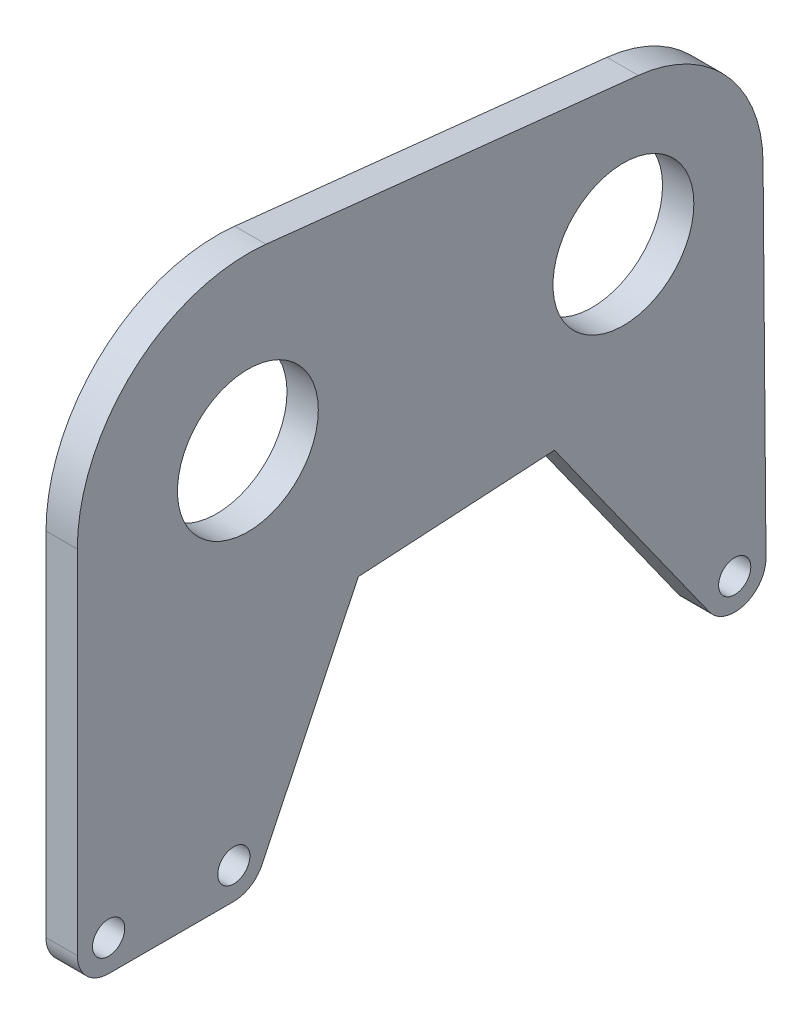
ISO-10303-21;
HEADER;
FILE_DESCRIPTION(('STEP AP214'),'2;1');
FILE_NAME('part.step','',(''),(''),'','','');
FILE_SCHEMA(('AUTOMOTIVE_DESIGN { 1 0 10303 214 1 1 1 1 }'));
ENDSEC;
DATA;
#1=APPLICATION_CONTEXT('core data for automotive mechanical design processes');
#2=APPLICATION_PROTOCOL_DEFINITION('international standard','automotive_design',2000,#1);
#3=PRODUCT_CONTEXT('',#1,'mechanical');
#4=PRODUCT('Part','Part','',(#3));
#5=PRODUCT_RELATED_PRODUCT_CATEGORY('part','',(#4));
#6=PRODUCT_DEFINITION_FORMATION('','',#4);
#7=PRODUCT_DEFINITION_CONTEXT('part definition',#1,'design');
#8=PRODUCT_DEFINITION('design','',#6,#7);
#9=PRODUCT_DEFINITION_SHAPE('','',#8);
#10=(LENGTH_UNIT() NAMED_UNIT(*) SI_UNIT(.MILLI.,.METRE.));
#11=(NAMED_UNIT(*) PLANE_ANGLE_UNIT() SI_UNIT($,.RADIAN.));
#12=(NAMED_UNIT(*) SI_UNIT($,.STERADIAN.) SOLID_ANGLE_UNIT());
#13=UNCERTAINTY_MEASURE_WITH_UNIT(LENGTH_MEASURE(1.E-05),#10,'distance_accuracy_value','');
#14=(GEOMETRIC_REPRESENTATION_CONTEXT(3) GLOBAL_UNCERTAINTY_ASSIGNED_CONTEXT((#13)) GLOBAL_UNIT_ASSIGNED_CONTEXT((#10,
#11,#12)) REPRESENTATION_CONTEXT('',''));
#15=CARTESIAN_POINT('',(0.,0.,0.));
#16=DIRECTION('',(0.,0.,1.));
#17=DIRECTION('',(1.,0.,0.));
#18=AXIS2_PLACEMENT_3D('',#15,#16,#17);
#19=CARTESIAN_POINT('',(6.35,1.3559669337432,-159.202917567701));
#20=DIRECTION('',(0.,0.00851691523062105,-0.999963730419736));
#21=DIRECTION('',(0.,0.999963730419736,0.00851691523062105));
#22=AXIS2_PLACEMENT_3D('',#19,#20,#21);
#23=PLANE('',#22);
#24=DIRECTION('',(0.,-0.999963730419736,-0.00851691523062105));
#25=VECTOR('',#24,1.);
#26=CARTESIAN_POINT('',(0.,1.3559669337432,-159.202917567701));
#27=LINE('',#26,#25);
#28=CARTESIAN_POINT('',(0.,-33.3606746563601,-159.498606985747));
#29=VERTEX_POINT('',#28);
#30=CARTESIAN_POINT('',(0.,-103.129192537428,-160.092841090928));
#31=VERTEX_POINT('',#30);
#32=EDGE_CURVE('E170',#29,#31,#27,.T.);
#33=ORIENTED_EDGE('',*,*,#32,.F.);
#34=DIRECTION('',(-1.,0.,0.));
#35=VECTOR('',#34,1.);
#36=CARTESIAN_POINT('',(6.35,-33.3606746563601,-159.498606985747));
#37=LINE('',#36,#35);
#38=CARTESIAN_POINT('',(6.35,-33.3606746563601,-159.498606985747));
#39=VERTEX_POINT('',#38);
#40=EDGE_CURVE('E11',#39,#29,#37,.T.);
#41=ORIENTED_EDGE('',*,*,#40,.F.);
#42=DIRECTION('',(0.,-0.999963730419736,-0.00851691523062105));
#43=VECTOR('',#42,1.);
#44=CARTESIAN_POINT('',(6.35,1.3559669337432,-159.202917567701));
#45=LINE('',#44,#43);
#46=CARTESIAN_POINT('',(6.35,-103.129192537428,-160.092841090928));
#47=VERTEX_POINT('',#46);
#48=EDGE_CURVE('E210',#39,#47,#45,.T.);
#49=ORIENTED_EDGE('',*,*,#48,.T.);
#50=DIRECTION('',(-1.,0.,0.));
#51=VECTOR('',#50,1.);
#52=CARTESIAN_POINT('',(6.35,-103.129192537428,-160.092841090928));
#53=LINE('',#52,#51);
#54=EDGE_CURVE('E100',#47,#31,#53,.T.);
#55=ORIENTED_EDGE('',*,*,#54,.T.);
#56=EDGE_LOOP('',(#33,#41,#49,#55));
#57=FACE_BOUND('',#56,.T.);
#58=ADVANCED_FACE('F37',(#57),#23,.T.);
#59=CARTESIAN_POINT('',(6.35,-33.6019548576729,-131.17010498144));
#60=DIRECTION('',(-1.,0.,0.));
#61=DIRECTION('',(0.,0.,1.));
#62=AXIS2_PLACEMENT_3D('',#59,#60,#61);
#63=CYLINDRICAL_SURFACE('',#62,28.329529504451);
#64=CARTESIAN_POINT('',(0.,-33.6019548576729,-131.17010498144));
#65=DIRECTION('',(1.,0.,0.));
#66=DIRECTION('',(0.,0.,-1.));
#67=AXIS2_PLACEMENT_3D('',#64,#65,#66);
#68=CIRCLE('',#67,28.329529504451);
#69=CARTESIAN_POINT('',(0.,-5.43348548716646,-134.18665520751));
#70=VERTEX_POINT('',#69);
#71=EDGE_CURVE('E173',#29,#70,#68,.T.);
#72=ORIENTED_EDGE('',*,*,#71,.T.);
#73=DIRECTION('',(-1.,0.,0.));
#74=VECTOR('',#73,1.);
#75=CARTESIAN_POINT('',(6.35,-5.43348548716646,-134.18665520751));
#76=LINE('',#75,#74);
#77=CARTESIAN_POINT('',(6.35,-5.43348548716646,-134.18665520751));
#78=VERTEX_POINT('',#77);
#79=EDGE_CURVE('E45',#78,#70,#76,.T.);
#80=ORIENTED_EDGE('',*,*,#79,.F.);
#81=CARTESIAN_POINT('',(6.35,-33.6019548576729,-131.17010498144));
#82=DIRECTION('',(1.,0.,0.));
#83=DIRECTION('',(0.,0.,-1.));
#84=AXIS2_PLACEMENT_3D('',#81,#82,#83);
#85=CIRCLE('',#84,28.329529504451);
#86=EDGE_CURVE('E279',#39,#78,#85,.T.);
#87=ORIENTED_EDGE('',*,*,#86,.F.);
#88=ORIENTED_EDGE('',*,*,#40,.T.);
#89=EDGE_LOOP('',(#72,#80,#87,#88));
#90=FACE_BOUND('',#89,.T.);
#91=ADVANCED_FACE('F239',(#90),#63,.T.);
#92=CARTESIAN_POINT('',(6.35,8.83518672114003,-0.946156645945603));
#93=DIRECTION('',(0.,0.994314761425204,-0.106480773907502));
#94=DIRECTION('',(0.,0.106480773907502,0.994314761425204));
#95=AXIS2_PLACEMENT_3D('',#92,#93,#94);
#96=PLANE('',#95);
#97=DIRECTION('',(0.,-0.106480773907502,-0.994314761425204));
#98=VECTOR('',#97,1.);
#99=CARTESIAN_POINT('',(0.,8.83518672114003,-0.946156645945603));
#100=LINE('',#99,#98);
#101=CARTESIAN_POINT('',(0.,2.65283508819284,-58.6767991213711));
#102=VERTEX_POINT('',#101);
#103=EDGE_CURVE('E176',#102,#70,#100,.T.);
#104=ORIENTED_EDGE('',*,*,#103,.F.);
#105=DIRECTION('',(-1.,0.,0.));
#106=VECTOR('',#105,1.);
#107=CARTESIAN_POINT('',(6.35,2.65283508819284,-58.6767991213711));
#108=LINE('',#107,#106);
#109=CARTESIAN_POINT('',(6.35,2.65283508819284,-58.6767991213711));
#110=VERTEX_POINT('',#109);
#111=EDGE_CURVE('E229',#110,#102,#108,.T.);
#112=ORIENTED_EDGE('',*,*,#111,.F.);
#113=DIRECTION('',(0.,-0.106480773907502,-0.994314761425204));
#114=VECTOR('',#113,1.);
#115=CARTESIAN_POINT('',(6.35,8.83518672114003,-0.946156645945603));
#116=LINE('',#115,#114);
#117=EDGE_CURVE('E236',#110,#78,#116,.T.);
#118=ORIENTED_EDGE('',*,*,#117,.T.);
#119=ORIENTED_EDGE('',*,*,#79,.T.);
#120=EDGE_LOOP('',(#104,#112,#118,#119));
#121=FACE_BOUND('',#120,.T.);
#122=ADVANCED_FACE('F234',(#121),#96,.T.);
#123=CARTESIAN_POINT('',(6.35,-31.7500000000001,-54.9926131403119));
#124=DIRECTION('',(-1.,0.,0.));
#125=DIRECTION('',(0.,0.,1.));
#126=AXIS2_PLACEMENT_3D('',#123,#124,#125);
#127=CYLINDRICAL_SURFACE('',#126,34.5995417375496);
#128=CARTESIAN_POINT('',(0.,-31.7500000000001,-54.9926131403119));
#129=DIRECTION('',(1.,0.,0.));
#130=DIRECTION('',(0.,0.,-1.));
#131=AXIS2_PLACEMENT_3D('',#128,#129,#130);
#132=CIRCLE('',#131,34.5995417375496);
#133=CARTESIAN_POINT('',(0.,-31.7500000000001,-20.3930714027624));
#134=VERTEX_POINT('',#133);
#135=EDGE_CURVE('E179',#102,#134,#132,.T.);
#136=ORIENTED_EDGE('',*,*,#135,.T.);
#137=DIRECTION('',(-1.,0.,0.));
#138=VECTOR('',#137,1.);
#139=CARTESIAN_POINT('',(6.35,-31.7500000000001,-20.3930714027624));
#140=LINE('',#139,#138);
#141=CARTESIAN_POINT('',(6.35,-31.7500000000001,-20.3930714027624));
#142=VERTEX_POINT('',#141);
#143=EDGE_CURVE('E226',#142,#134,#140,.T.);
#144=ORIENTED_EDGE('',*,*,#143,.F.);
#145=CARTESIAN_POINT('',(6.35,-31.7500000000001,-54.9926131403119));
#146=DIRECTION('',(1.,0.,0.));
#147=DIRECTION('',(0.,0.,-1.));
#148=AXIS2_PLACEMENT_3D('',#145,#146,#147);
#149=CIRCLE('',#148,34.5995417375496);
#150=EDGE_CURVE('E257',#110,#142,#149,.T.);
#151=ORIENTED_EDGE('',*,*,#150,.F.);
#152=ORIENTED_EDGE('',*,*,#111,.T.);
#153=EDGE_LOOP('',(#136,#144,#151,#152));
#154=FACE_BOUND('',#153,.T.);
#155=ADVANCED_FACE('F248',(#154),#127,.T.);
#156=CARTESIAN_POINT('',(6.35,0.,-20.3930714027624));
#157=DIRECTION('',(0.,0.,-1.));
#158=DIRECTION('',(0.,1.,0.));
#159=AXIS2_PLACEMENT_3D('',#156,#157,#158);
#160=PLANE('',#159);
#161=DIRECTION('',(0.,-1.,0.));
#162=VECTOR('',#161,1.);
#163=CARTESIAN_POINT('',(0.,0.,-20.3930714027624));
#164=LINE('',#163,#162);
#165=CARTESIAN_POINT('',(0.,-103.183274949142,-20.3930714027624));
#166=VERTEX_POINT('',#165);
#167=EDGE_CURVE('E181',#134,#166,#164,.T.);
#168=ORIENTED_EDGE('',*,*,#167,.T.);
#169=DIRECTION('',(-1.,0.,0.));
#170=VECTOR('',#169,1.);
#171=CARTESIAN_POINT('',(6.35,-103.183274949142,-20.3930714027624));
#172=LINE('',#171,#170);
#173=CARTESIAN_POINT('',(6.35,-103.183274949142,-20.3930714027624));
#174=VERTEX_POINT('',#173);
#175=EDGE_CURVE('E223',#174,#166,#172,.T.);
#176=ORIENTED_EDGE('',*,*,#175,.F.);
#177=DIRECTION('',(0.,-1.,0.));
#178=VECTOR('',#177,1.);
#179=CARTESIAN_POINT('',(6.35,0.,-20.3930714027624));
#180=LINE('',#179,#178);
#181=EDGE_CURVE('E254',#142,#174,#180,.T.);
#182=ORIENTED_EDGE('',*,*,#181,.F.);
#183=ORIENTED_EDGE('',*,*,#143,.T.);
#184=EDGE_LOOP('',(#168,#176,#182,#183));
#185=FACE_BOUND('',#184,.T.);
#186=ADVANCED_FACE('F252',(#185),#160,.F.);
#187=CARTESIAN_POINT('',(6.35,-103.183274949142,-26.7430714027624));
#188=DIRECTION('',(-1.,0.,0.));
#189=DIRECTION('',(0.,0.,1.));
#190=AXIS2_PLACEMENT_3D('',#187,#188,#189);
#191=CYLINDRICAL_SURFACE('',#190,6.35);
#192=CARTESIAN_POINT('',(0.,-103.183274949142,-26.7430714027624));
#193=DIRECTION('',(1.,0.,0.));
#194=DIRECTION('',(0.,0.,-1.));
#195=AXIS2_PLACEMENT_3D('',#192,#193,#194);
#196=CIRCLE('',#195,6.35);
#197=CARTESIAN_POINT('',(0.,-109.533274949142,-26.7430714027624));
#198=VERTEX_POINT('',#197);
#199=EDGE_CURVE('E183',#166,#198,#196,.T.);
#200=ORIENTED_EDGE('',*,*,#199,.T.);
#201=DIRECTION('',(-1.,0.,0.));
#202=VECTOR('',#201,1.);
#203=CARTESIAN_POINT('',(6.35,-109.533274949142,-26.7430714027624));
#204=LINE('',#203,#202);
#205=CARTESIAN_POINT('',(6.35,-109.533274949142,-26.7430714027624));
#206=VERTEX_POINT('',#205);
#207=EDGE_CURVE('E220',#206,#198,#204,.T.);
#208=ORIENTED_EDGE('',*,*,#207,.F.);
#209=CARTESIAN_POINT('',(6.35,-103.183274949142,-26.7430714027624));
#210=DIRECTION('',(1.,0.,0.));
#211=DIRECTION('',(0.,0.,-1.));
#212=AXIS2_PLACEMENT_3D('',#209,#210,#211);
#213=CIRCLE('',#212,6.35);
#214=EDGE_CURVE('E256',#174,#206,#213,.T.);
#215=ORIENTED_EDGE('',*,*,#214,.F.);
#216=ORIENTED_EDGE('',*,*,#175,.T.);
#217=EDGE_LOOP('',(#200,#208,#215,#216));
#218=FACE_BOUND('',#217,.T.);
#219=ADVANCED_FACE('F295',(#218),#191,.T.);
#220=CARTESIAN_POINT('',(6.35,-109.533274949142,0.));
#221=DIRECTION('',(0.,1.,0.));
#222=DIRECTION('',(0.,0.,1.));
#223=AXIS2_PLACEMENT_3D('',#220,#221,#222);
#224=PLANE('',#223);
#225=DIRECTION('',(0.,0.,-1.));
#226=VECTOR('',#225,1.);
#227=CARTESIAN_POINT('',(0.,-109.533274949142,0.));
#228=LINE('',#227,#226);
#229=CARTESIAN_POINT('',(0.,-109.533274949142,-52.1430714027624));
#230=VERTEX_POINT('',#229);
#231=EDGE_CURVE('E185',#198,#230,#228,.T.);
#232=ORIENTED_EDGE('',*,*,#231,.T.);
#233=DIRECTION('',(-1.,0.,0.));
#234=VECTOR('',#233,1.);
#235=CARTESIAN_POINT('',(6.35,-109.533274949142,-52.1430714027624));
#236=LINE('',#235,#234);
#237=CARTESIAN_POINT('',(6.35,-109.533274949142,-52.1430714027624));
#238=VERTEX_POINT('',#237);
#239=EDGE_CURVE('E217',#238,#230,#236,.T.);
#240=ORIENTED_EDGE('',*,*,#239,.F.);
#241=DIRECTION('',(0.,0.,-1.));
#242=VECTOR('',#241,1.);
#243=CARTESIAN_POINT('',(6.35,-109.533274949142,0.));
#244=LINE('',#243,#242);
#245=EDGE_CURVE('E259',#206,#238,#244,.T.);
#246=ORIENTED_EDGE('',*,*,#245,.F.);
#247=ORIENTED_EDGE('',*,*,#207,.T.);
#248=EDGE_LOOP('',(#232,#240,#246,#247));
#249=FACE_BOUND('',#248,.T.);
#250=ADVANCED_FACE('F298',(#249),#224,.F.);
#251=CARTESIAN_POINT('',(6.35,-103.183274949142,-52.1430714027624));
#252=DIRECTION('',(-1.,0.,0.));
#253=DIRECTION('',(0.,0.,1.));
#254=AXIS2_PLACEMENT_3D('',#251,#252,#253);
#255=CYLINDRICAL_SURFACE('',#254,6.34999999999999);
#256=CARTESIAN_POINT('',(0.,-103.183274949142,-52.1430714027624));
#257=DIRECTION('',(1.,0.,0.));
#258=DIRECTION('',(0.,0.,-1.));
#259=AXIS2_PLACEMENT_3D('',#256,#257,#258);
#260=CIRCLE('',#259,6.34999999999999);
#261=CARTESIAN_POINT('',(0.,-105.923011398147,-57.8716265600418));
#262=VERTEX_POINT('',#261);
#263=EDGE_CURVE('E187',#230,#262,#260,.T.);
#264=ORIENTED_EDGE('',*,*,#263,.T.);
#265=DIRECTION('',(-1.,0.,0.));
#266=VECTOR('',#265,1.);
#267=CARTESIAN_POINT('',(6.35,-105.923011398147,-57.8716265600418));
#268=LINE('',#267,#266);
#269=CARTESIAN_POINT('',(6.35,-105.923011398147,-57.8716265600418));
#270=VERTEX_POINT('',#269);
#271=EDGE_CURVE('E214',#270,#262,#268,.T.);
#272=ORIENTED_EDGE('',*,*,#271,.F.);
#273=CARTESIAN_POINT('',(6.35,-103.183274949142,-52.1430714027624));
#274=DIRECTION('',(1.,0.,0.));
#275=DIRECTION('',(0.,0.,-1.));
#276=AXIS2_PLACEMENT_3D('',#273,#274,#275);
#277=CIRCLE('',#276,6.34999999999999);
#278=EDGE_CURVE('E265',#238,#270,#277,.T.);
#279=ORIENTED_EDGE('',*,*,#278,.F.);
#280=ORIENTED_EDGE('',*,*,#239,.T.);
#281=EDGE_LOOP('',(#264,#272,#279,#280));
#282=FACE_BOUND('',#281,.T.);
#283=ADVANCED_FACE('F271',(#282),#255,.T.);
#284=CARTESIAN_POINT('',(6.35,-42.2432701322615,-88.3270736002361));
#285=DIRECTION('',(0.,0.43145455889843,0.902134670437713));
#286=DIRECTION('',(0.,-0.902134670437713,0.43145455889843));
#287=AXIS2_PLACEMENT_3D('',#284,#285,#286);
#288=PLANE('',#287);
#289=DIRECTION('',(0.,0.902134670437713,-0.43145455889843));
#290=VECTOR('',#289,1.);
#291=CARTESIAN_POINT('',(0.,-42.2432701322615,-88.3270736002361));
#292=LINE('',#291,#290);
#293=CARTESIAN_POINT('',(0.,-65.105702066972,-77.392896244044));
#294=VERTEX_POINT('',#293);
#295=EDGE_CURVE('E189',#262,#294,#292,.T.);
#296=ORIENTED_EDGE('',*,*,#295,.T.);
#297=DIRECTION('',(-1.,0.,0.));
#298=VECTOR('',#297,1.);
#299=CARTESIAN_POINT('',(6.35,-65.105702066972,-77.392896244044));
#300=LINE('',#299,#298);
#301=CARTESIAN_POINT('',(6.35,-65.105702066972,-77.392896244044));
#302=VERTEX_POINT('',#301);
#303=EDGE_CURVE('E147',#302,#294,#300,.T.);
#304=ORIENTED_EDGE('',*,*,#303,.F.);
#305=DIRECTION('',(0.,0.902134670437713,-0.43145455889843));
#306=VECTOR('',#305,1.);
#307=CARTESIAN_POINT('',(6.35,-42.2432701322615,-88.3270736002361));
#308=LINE('',#307,#306);
#309=EDGE_CURVE('E138',#270,#302,#308,.T.);
#310=ORIENTED_EDGE('',*,*,#309,.F.);
#311=ORIENTED_EDGE('',*,*,#271,.T.);
#312=EDGE_LOOP('',(#296,#304,#310,#311));
#313=FACE_BOUND('',#312,.T.);
#314=ADVANCED_FACE('F275',(#313),#288,.F.);
#315=CARTESIAN_POINT('',(6.35,-69.3705476391629,-4.03291650273945));
#316=DIRECTION('',(0.,0.998314382402172,0.0580378659925547));
#317=DIRECTION('',(0.,-0.0580378659925547,0.998314382402172));
#318=AXIS2_PLACEMENT_3D('',#315,#316,#317);
#319=PLANE('',#318);
#320=DIRECTION('',(0.,0.0580378659925547,-0.998314382402172));
#321=VECTOR('',#320,1.);
#322=CARTESIAN_POINT('',(0.,-69.3705476391629,-4.03291650273945));
#323=LINE('',#322,#321);
#324=CARTESIAN_POINT('',(0.,-62.7926420269908,-117.180043234755));
#325=VERTEX_POINT('',#324);
#326=EDGE_CURVE('E146',#294,#325,#323,.T.);
#327=ORIENTED_EDGE('',*,*,#326,.T.);
#328=DIRECTION('',(-1.,0.,0.));
#329=VECTOR('',#328,1.);
#330=CARTESIAN_POINT('',(6.35,-62.7926420269908,-117.180043234755));
#331=LINE('',#330,#329);
#332=CARTESIAN_POINT('',(6.35,-62.7926420269908,-117.180043234755));
#333=VERTEX_POINT('',#332);
#334=EDGE_CURVE('E143',#333,#325,#331,.T.);
#335=ORIENTED_EDGE('',*,*,#334,.F.);
#336=DIRECTION('',(0.,0.0580378659925547,-0.998314382402172));
#337=VECTOR('',#336,1.);
#338=CARTESIAN_POINT('',(6.35,-69.3705476391629,-4.03291650273945));
#339=LINE('',#338,#337);
#340=EDGE_CURVE('E131',#302,#333,#339,.T.);
#341=ORIENTED_EDGE('',*,*,#340,.F.);
#342=ORIENTED_EDGE('',*,*,#303,.T.);
#343=EDGE_LOOP('',(#327,#335,#341,#342));
#344=FACE_BOUND('',#343,.T.);
#345=ADVANCED_FACE('F144',(#344),#319,.F.);
#346=CARTESIAN_POINT('',(6.35,34.2382805707716,-48.0724800233674));
#347=DIRECTION('',(0.,0.580124617176137,-0.814527733442048));
#348=DIRECTION('',(0.,0.814527733442048,0.580124617176137));
#349=AXIS2_PLACEMENT_3D('',#346,#347,#348);
#350=PLANE('',#349);
#351=DIRECTION('',(0.,-0.814527733442048,-0.580124617176137));
#352=VECTOR('',#351,1.);
#353=CARTESIAN_POINT('',(0.,34.2382805707716,-48.0724800233674));
#354=LINE('',#353,#352);
#355=CARTESIAN_POINT('',(0.,-106.867066268211,-148.570820295405));
#356=VERTEX_POINT('',#355);
#357=EDGE_CURVE('E93',#325,#356,#354,.T.);
#358=ORIENTED_EDGE('',*,*,#357,.T.);
#359=DIRECTION('',(-1.,0.,0.));
#360=VECTOR('',#359,1.);
#361=CARTESIAN_POINT('',(6.35,-106.867066268211,-148.570820295405));
#362=LINE('',#361,#360);
#363=CARTESIAN_POINT('',(6.35,-106.867066268211,-148.570820295405));
#364=VERTEX_POINT('',#363);
#365=EDGE_CURVE('E148',#364,#356,#362,.T.);
#366=ORIENTED_EDGE('',*,*,#365,.F.);
#367=DIRECTION('',(0.,-0.814527733442048,-0.580124617176137));
#368=VECTOR('',#367,1.);
#369=CARTESIAN_POINT('',(6.35,34.2382805707716,-48.0724800233674));
#370=LINE('',#369,#368);
#371=EDGE_CURVE('E136',#333,#364,#370,.T.);
#372=ORIENTED_EDGE('',*,*,#371,.F.);
#373=ORIENTED_EDGE('',*,*,#334,.T.);
#374=EDGE_LOOP('',(#358,#366,#372,#373));
#375=FACE_BOUND('',#374,.T.);
#376=ADVANCED_FACE('F150',(#375),#350,.F.);
#377=CARTESIAN_POINT('',(6.35,-103.183274949142,-26.7430714027624));
#378=DIRECTION('',(-1.,0.,0.));
#379=DIRECTION('',(0.,0.,1.));
#380=AXIS2_PLACEMENT_3D('',#377,#378,#379);
#381=CYLINDRICAL_SURFACE('',#380,3.2639);
#382=CARTESIAN_POINT('',(6.35,-103.183274949142,-26.7430714027624));
#383=DIRECTION('',(1.,0.,0.));
#384=DIRECTION('',(0.,0.,-1.));
#385=AXIS2_PLACEMENT_3D('',#382,#383,#384);
#386=CIRCLE('',#385,3.2639);
#387=CARTESIAN_POINT('',(6.35,-103.183274949142,-30.0069714027624));
#388=VERTEX_POINT('',#387);
#389=EDGE_CURVE('E164',#388,#388,#386,.T.);
#390=ORIENTED_EDGE('',*,*,#389,.T.);
#391=EDGE_LOOP('',(#390));
#392=FACE_BOUND('',#391,.T.);
#393=CARTESIAN_POINT('',(0.,-103.183274949142,-26.7430714027624));
#394=DIRECTION('',(1.,0.,0.));
#395=DIRECTION('',(0.,0.,-1.));
#396=AXIS2_PLACEMENT_3D('',#393,#394,#395);
#397=CIRCLE('',#396,3.2639);
#398=CARTESIAN_POINT('',(0.,-103.183274949142,-30.0069714027624));
#399=VERTEX_POINT('',#398);
#400=EDGE_CURVE('E204',#399,#399,#397,.T.);
#401=ORIENTED_EDGE('',*,*,#400,.F.);
#402=EDGE_LOOP('',(#401));
#403=FACE_BOUND('',#402,.T.);
#404=ADVANCED_FACE('F311',(#392,#403),#381,.F.);
#405=CARTESIAN_POINT('',(6.35,-103.183274949142,-52.1430714027624));
#406=DIRECTION('',(-1.,0.,0.));
#407=DIRECTION('',(0.,0.,1.));
#408=AXIS2_PLACEMENT_3D('',#405,#406,#407);
#409=CYLINDRICAL_SURFACE('',#408,3.26389999999998);
#410=CARTESIAN_POINT('',(6.35,-103.183274949142,-52.1430714027624));
#411=DIRECTION('',(1.,0.,0.));
#412=DIRECTION('',(0.,0.,-1.));
#413=AXIS2_PLACEMENT_3D('',#410,#411,#412);
#414=CIRCLE('',#413,3.26389999999998);
#415=CARTESIAN_POINT('',(6.35,-103.183274949142,-55.4069714027623));
#416=VERTEX_POINT('',#415);
#417=EDGE_CURVE('E161',#416,#416,#414,.T.);
#418=ORIENTED_EDGE('',*,*,#417,.T.);
#419=EDGE_LOOP('',(#418));
#420=FACE_BOUND('',#419,.T.);
#421=CARTESIAN_POINT('',(0.,-103.183274949142,-52.1430714027624));
#422=DIRECTION('',(1.,0.,0.));
#423=DIRECTION('',(0.,0.,-1.));
#424=AXIS2_PLACEMENT_3D('',#421,#422,#423);
#425=CIRCLE('',#424,3.26389999999998);
#426=CARTESIAN_POINT('',(0.,-103.183274949142,-55.4069714027623));
#427=VERTEX_POINT('',#426);
#428=EDGE_CURVE('E201',#427,#427,#425,.T.);
#429=ORIENTED_EDGE('',*,*,#428,.F.);
#430=EDGE_LOOP('',(#429));
#431=FACE_BOUND('',#430,.T.);
#432=ADVANCED_FACE('F322',(#420,#431),#409,.F.);
#433=CARTESIAN_POINT('',(6.35,-33.6019548576729,-131.17010498144));
#434=DIRECTION('',(-1.,0.,0.));
#435=DIRECTION('',(0.,0.,1.));
#436=AXIS2_PLACEMENT_3D('',#433,#434,#435);
#437=CYLINDRICAL_SURFACE('',#436,14.2874999999999);
#438=CARTESIAN_POINT('',(6.35,-33.6019548576729,-131.17010498144));
#439=DIRECTION('',(1.,0.,0.));
#440=DIRECTION('',(0.,0.,-1.));
#441=AXIS2_PLACEMENT_3D('',#438,#439,#440);
#442=CIRCLE('',#441,14.2874999999999);
#443=CARTESIAN_POINT('',(6.35,-33.6019548576729,-145.45760498144));
#444=VERTEX_POINT('',#443);
#445=EDGE_CURVE('E158',#444,#444,#442,.T.);
#446=ORIENTED_EDGE('',*,*,#445,.T.);
#447=EDGE_LOOP('',(#446));
#448=FACE_BOUND('',#447,.T.);
#449=CARTESIAN_POINT('',(0.,-33.6019548576729,-131.17010498144));
#450=DIRECTION('',(1.,0.,0.));
#451=DIRECTION('',(0.,0.,-1.));
#452=AXIS2_PLACEMENT_3D('',#449,#450,#451);
#453=CIRCLE('',#452,14.2874999999999);
#454=CARTESIAN_POINT('',(0.,-33.6019548576729,-145.45760498144));
#455=VERTEX_POINT('',#454);
#456=EDGE_CURVE('E198',#455,#455,#453,.T.);
#457=ORIENTED_EDGE('',*,*,#456,.F.);
#458=EDGE_LOOP('',(#457));
#459=FACE_BOUND('',#458,.T.);
#460=ADVANCED_FACE('F318',(#448,#459),#437,.F.);
#461=CARTESIAN_POINT('',(6.35,-31.7500000000001,-54.9926131403119));
#462=DIRECTION('',(-1.,0.,0.));
#463=DIRECTION('',(0.,0.,1.));
#464=AXIS2_PLACEMENT_3D('',#461,#462,#463);
#465=CYLINDRICAL_SURFACE('',#464,14.2875);
#466=CARTESIAN_POINT('',(6.35,-31.7500000000001,-54.9926131403119));
#467=DIRECTION('',(1.,0.,0.));
#468=DIRECTION('',(0.,0.,-1.));
#469=AXIS2_PLACEMENT_3D('',#466,#467,#468);
#470=CIRCLE('',#469,14.2875);
#471=CARTESIAN_POINT('',(6.35,-31.7500000000001,-69.2801131403119));
#472=VERTEX_POINT('',#471);
#473=EDGE_CURVE('E152',#472,#472,#470,.T.);
#474=ORIENTED_EDGE('',*,*,#473,.T.);
#475=EDGE_LOOP('',(#474));
#476=FACE_BOUND('',#475,.T.);
#477=CARTESIAN_POINT('',(0.,-31.7500000000001,-54.9926131403119));
#478=DIRECTION('',(1.,0.,0.));
#479=DIRECTION('',(0.,0.,-1.));
#480=AXIS2_PLACEMENT_3D('',#477,#478,#479);
#481=CIRCLE('',#480,14.2875);
#482=CARTESIAN_POINT('',(0.,-31.7500000000001,-69.2801131403119));
#483=VERTEX_POINT('',#482);
#484=EDGE_CURVE('E195',#483,#483,#481,.T.);
#485=ORIENTED_EDGE('',*,*,#484,.F.);
#486=EDGE_LOOP('',(#485));
#487=FACE_BOUND('',#486,.T.);
#488=ADVANCED_FACE('F315',(#476,#487),#465,.F.);
#489=CARTESIAN_POINT('',(6.35,-103.183274949142,-153.743071402762));
#490=DIRECTION('',(-1.,0.,0.));
#491=DIRECTION('',(0.,0.,1.));
#492=AXIS2_PLACEMENT_3D('',#489,#490,#491);
#493=CYLINDRICAL_SURFACE('',#492,6.34999999999999);
#494=CARTESIAN_POINT('',(0.,-103.183274949142,-153.743071402762));
#495=DIRECTION('',(1.,0.,0.));
#496=DIRECTION('',(0.,0.,-1.));
#497=AXIS2_PLACEMENT_3D('',#494,#495,#496);
#498=CIRCLE('',#497,6.34999999999999);
#499=EDGE_CURVE('E193',#356,#31,#498,.T.);
#500=ORIENTED_EDGE('',*,*,#499,.T.);
#501=ORIENTED_EDGE('',*,*,#54,.F.);
#502=CARTESIAN_POINT('',(6.35,-103.183274949142,-153.743071402762));
#503=DIRECTION('',(1.,0.,0.));
#504=DIRECTION('',(0.,0.,-1.));
#505=AXIS2_PLACEMENT_3D('',#502,#503,#504);
#506=CIRCLE('',#505,6.34999999999999);
#507=EDGE_CURVE('E53',#364,#47,#506,.T.);
#508=ORIENTED_EDGE('',*,*,#507,.F.);
#509=ORIENTED_EDGE('',*,*,#365,.T.);
#510=EDGE_LOOP('',(#500,#501,#508,#509));
#511=FACE_BOUND('',#510,.T.);
#512=ADVANCED_FACE('F278',(#511),#493,.T.);
#513=CARTESIAN_POINT('',(6.35,-103.183274949142,-153.743071402762));
#514=DIRECTION('',(-1.,0.,0.));
#515=DIRECTION('',(0.,0.,1.));
#516=AXIS2_PLACEMENT_3D('',#513,#514,#515);
#517=CYLINDRICAL_SURFACE('',#516,3.26390000000001);
#518=CARTESIAN_POINT('',(6.35,-103.183274949142,-153.743071402762));
#519=DIRECTION('',(1.,0.,0.));
#520=DIRECTION('',(0.,0.,-1.));
#521=AXIS2_PLACEMENT_3D('',#518,#519,#520);
#522=CIRCLE('',#521,3.26390000000001);
#523=CARTESIAN_POINT('',(6.35,-103.183274949142,-157.006971402762));
#524=VERTEX_POINT('',#523);
#525=EDGE_CURVE('E167',#524,#524,#522,.T.);
#526=ORIENTED_EDGE('',*,*,#525,.T.);
#527=EDGE_LOOP('',(#526));
#528=FACE_BOUND('',#527,.T.);
#529=CARTESIAN_POINT('',(0.,-103.183274949142,-153.743071402762));
#530=DIRECTION('',(1.,0.,0.));
#531=DIRECTION('',(0.,0.,-1.));
#532=AXIS2_PLACEMENT_3D('',#529,#530,#531);
#533=CIRCLE('',#532,3.26390000000001);
#534=CARTESIAN_POINT('',(0.,-103.183274949142,-157.006971402762));
#535=VERTEX_POINT('',#534);
#536=EDGE_CURVE('E207',#535,#535,#533,.T.);
#537=ORIENTED_EDGE('',*,*,#536,.F.);
#538=EDGE_LOOP('',(#537));
#539=FACE_BOUND('',#538,.T.);
#540=ADVANCED_FACE('F314',(#528,#539),#517,.F.);
#541=CARTESIAN_POINT('',(6.35,0.,0.));
#542=DIRECTION('',(1.,0.,0.));
#543=DIRECTION('',(0.,0.,-1.));
#544=AXIS2_PLACEMENT_3D('',#541,#542,#543);
#545=PLANE('',#544);
#546=ORIENTED_EDGE('',*,*,#48,.F.);
#547=ORIENTED_EDGE('',*,*,#86,.T.);
#548=ORIENTED_EDGE('',*,*,#117,.F.);
#549=ORIENTED_EDGE('',*,*,#150,.T.);
#550=ORIENTED_EDGE('',*,*,#181,.T.);
#551=ORIENTED_EDGE('',*,*,#214,.T.);
#552=ORIENTED_EDGE('',*,*,#245,.T.);
#553=ORIENTED_EDGE('',*,*,#278,.T.);
#554=ORIENTED_EDGE('',*,*,#309,.T.);
#555=ORIENTED_EDGE('',*,*,#340,.T.);
#556=ORIENTED_EDGE('',*,*,#371,.T.);
#557=ORIENTED_EDGE('',*,*,#507,.T.);
#558=EDGE_LOOP('',(#546,#547,#548,#549,#550,#551,#552,#553,#554,#555,#556,#557));
#559=FACE_BOUND('',#558,.T.);
#560=ORIENTED_EDGE('',*,*,#473,.F.);
#561=EDGE_LOOP('',(#560));
#562=FACE_BOUND('',#561,.T.);
#563=ORIENTED_EDGE('',*,*,#445,.F.);
#564=EDGE_LOOP('',(#563));
#565=FACE_BOUND('',#564,.T.);
#566=ORIENTED_EDGE('',*,*,#417,.F.);
#567=EDGE_LOOP('',(#566));
#568=FACE_BOUND('',#567,.T.);
#569=ORIENTED_EDGE('',*,*,#389,.F.);
#570=EDGE_LOOP('',(#569));
#571=FACE_BOUND('',#570,.T.);
#572=ORIENTED_EDGE('',*,*,#525,.F.);
#573=EDGE_LOOP('',(#572));
#574=FACE_BOUND('',#573,.T.);
#575=ADVANCED_FACE('F133',(#559,#562,#565,#568,#571,#574),#545,.T.);
#576=CARTESIAN_POINT('',(0.,0.,0.));
#577=DIRECTION('',(1.,0.,0.));
#578=DIRECTION('',(0.,0.,-1.));
#579=AXIS2_PLACEMENT_3D('',#576,#577,#578);
#580=PLANE('',#579);
#581=ORIENTED_EDGE('',*,*,#32,.T.);
#582=ORIENTED_EDGE('',*,*,#499,.F.);
#583=ORIENTED_EDGE('',*,*,#357,.F.);
#584=ORIENTED_EDGE('',*,*,#326,.F.);
#585=ORIENTED_EDGE('',*,*,#295,.F.);
#586=ORIENTED_EDGE('',*,*,#263,.F.);
#587=ORIENTED_EDGE('',*,*,#231,.F.);
#588=ORIENTED_EDGE('',*,*,#199,.F.);
#589=ORIENTED_EDGE('',*,*,#167,.F.);
#590=ORIENTED_EDGE('',*,*,#135,.F.);
#591=ORIENTED_EDGE('',*,*,#103,.T.);
#592=ORIENTED_EDGE('',*,*,#71,.F.);
#593=EDGE_LOOP('',(#581,#582,#583,#584,#585,#586,#587,#588,#589,#590,#591,#592));
#594=FACE_BOUND('',#593,.T.);
#595=ORIENTED_EDGE('',*,*,#484,.T.);
#596=EDGE_LOOP('',(#595));
#597=FACE_BOUND('',#596,.T.);
#598=ORIENTED_EDGE('',*,*,#456,.T.);
#599=EDGE_LOOP('',(#598));
#600=FACE_BOUND('',#599,.T.);
#601=ORIENTED_EDGE('',*,*,#428,.T.);
#602=EDGE_LOOP('',(#601));
#603=FACE_BOUND('',#602,.T.);
#604=ORIENTED_EDGE('',*,*,#400,.T.);
#605=EDGE_LOOP('',(#604));
#606=FACE_BOUND('',#605,.T.);
#607=ORIENTED_EDGE('',*,*,#536,.T.);
#608=EDGE_LOOP('',(#607));
#609=FACE_BOUND('',#608,.T.);
#610=ADVANCED_FACE('F242',(#594,#597,#600,#603,#606,#609),#580,.F.);
#611=CLOSED_SHELL('',(#58,#91,#122,#155,#186,#219,#250,#283,#314,#345,#376,#404,#432,#460,#488,
#512,#540,#575,#610));
#612=MANIFOLD_SOLID_BREP('B2',#611);
#613=ADVANCED_BREP_SHAPE_REPRESENTATION('',(#18,#612),#14);
#614=SHAPE_DEFINITION_REPRESENTATION(#9,#613);
ENDSEC;
END-ISO-10303-21;
